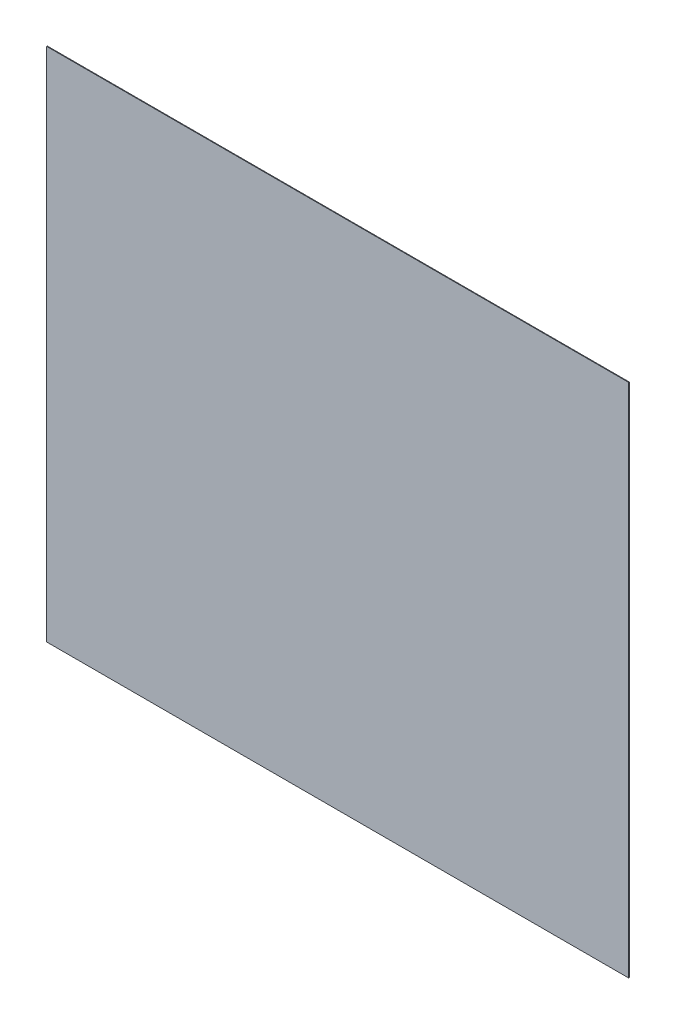
ISO-10303-21;
HEADER;
FILE_DESCRIPTION(('STEP AP214'),'2;1');
FILE_NAME('part.step','',(''),(''),'','','');
FILE_SCHEMA(('AUTOMOTIVE_DESIGN { 1 0 10303 214 1 1 1 1 }'));
ENDSEC;
DATA;
#1=APPLICATION_CONTEXT('core data for automotive mechanical design processes');
#2=APPLICATION_PROTOCOL_DEFINITION('international standard','automotive_design',2000,#1);
#3=PRODUCT_CONTEXT('',#1,'mechanical');
#4=PRODUCT('Part','Part','',(#3));
#5=PRODUCT_RELATED_PRODUCT_CATEGORY('part','',(#4));
#6=PRODUCT_DEFINITION_FORMATION('','',#4);
#7=PRODUCT_DEFINITION_CONTEXT('part definition',#1,'design');
#8=PRODUCT_DEFINITION('design','',#6,#7);
#9=PRODUCT_DEFINITION_SHAPE('','',#8);
#10=(LENGTH_UNIT() NAMED_UNIT(*) SI_UNIT(.MILLI.,.METRE.));
#11=(NAMED_UNIT(*) PLANE_ANGLE_UNIT() SI_UNIT($,.RADIAN.));
#12=(NAMED_UNIT(*) SI_UNIT($,.STERADIAN.) SOLID_ANGLE_UNIT());
#13=UNCERTAINTY_MEASURE_WITH_UNIT(LENGTH_MEASURE(1.E-05),#10,'distance_accuracy_value','');
#14=(GEOMETRIC_REPRESENTATION_CONTEXT(3) GLOBAL_UNCERTAINTY_ASSIGNED_CONTEXT((#13)) GLOBAL_UNIT_ASSIGNED_CONTEXT((#10,
#11,#12)) REPRESENTATION_CONTEXT('',''));
#15=CARTESIAN_POINT('',(0.,0.,0.));
#16=DIRECTION('',(0.,0.,1.));
#17=DIRECTION('',(1.,0.,0.));
#18=AXIS2_PLACEMENT_3D('',#15,#16,#17);
#19=CARTESIAN_POINT('',(706.,-625.75,-1.5875));
#20=DIRECTION('',(1.,0.,0.));
#21=DIRECTION('',(0.,0.,-1.));
#22=AXIS2_PLACEMENT_3D('',#19,#20,#21);
#23=PLANE('',#22);
#24=DIRECTION('',(0.,1.,0.));
#25=VECTOR('',#24,1.);
#26=CARTESIAN_POINT('',(706.,-625.75,0.));
#27=LINE('',#26,#25);
#28=CARTESIAN_POINT('',(706.,-625.75,0.));
#29=VERTEX_POINT('',#28);
#30=CARTESIAN_POINT('',(706.,625.75,0.));
#31=VERTEX_POINT('',#30);
#32=EDGE_CURVE('E104',#29,#31,#27,.T.);
#33=ORIENTED_EDGE('',*,*,#32,.F.);
#34=DIRECTION('',(0.,0.,1.));
#35=VECTOR('',#34,1.);
#36=CARTESIAN_POINT('',(706.,-625.75,-1.5875));
#37=LINE('',#36,#35);
#38=CARTESIAN_POINT('',(706.,-625.75,-1.5875));
#39=VERTEX_POINT('',#38);
#40=EDGE_CURVE('E11',#39,#29,#37,.T.);
#41=ORIENTED_EDGE('',*,*,#40,.F.);
#42=DIRECTION('',(0.,1.,0.));
#43=VECTOR('',#42,1.);
#44=CARTESIAN_POINT('',(706.,-625.75,-1.5875));
#45=LINE('',#44,#43);
#46=CARTESIAN_POINT('',(706.,625.75,-1.5875));
#47=VERTEX_POINT('',#46);
#48=EDGE_CURVE('E98',#39,#47,#45,.T.);
#49=ORIENTED_EDGE('',*,*,#48,.T.);
#50=DIRECTION('',(0.,0.,1.));
#51=VECTOR('',#50,1.);
#52=CARTESIAN_POINT('',(706.,625.75,-1.5875));
#53=LINE('',#52,#51);
#54=EDGE_CURVE('E43',#47,#31,#53,.T.);
#55=ORIENTED_EDGE('',*,*,#54,.T.);
#56=EDGE_LOOP('',(#33,#41,#49,#55));
#57=FACE_BOUND('',#56,.T.);
#58=ADVANCED_FACE('F40',(#57),#23,.T.);
#59=CARTESIAN_POINT('',(-706.,-625.75,-1.5875));
#60=DIRECTION('',(0.,-1.,0.));
#61=DIRECTION('',(0.,0.,-1.));
#62=AXIS2_PLACEMENT_3D('',#59,#60,#61);
#63=PLANE('',#62);
#64=DIRECTION('',(1.,0.,0.));
#65=VECTOR('',#64,1.);
#66=CARTESIAN_POINT('',(-706.,-625.75,0.));
#67=LINE('',#66,#65);
#68=CARTESIAN_POINT('',(-706.,-625.75,0.));
#69=VERTEX_POINT('',#68);
#70=EDGE_CURVE('E100',#69,#29,#67,.T.);
#71=ORIENTED_EDGE('',*,*,#70,.F.);
#72=DIRECTION('',(0.,0.,1.));
#73=VECTOR('',#72,1.);
#74=CARTESIAN_POINT('',(-706.,-625.75,-1.5875));
#75=LINE('',#74,#73);
#76=CARTESIAN_POINT('',(-706.,-625.75,-1.5875));
#77=VERTEX_POINT('',#76);
#78=EDGE_CURVE('E49',#77,#69,#75,.T.);
#79=ORIENTED_EDGE('',*,*,#78,.F.);
#80=DIRECTION('',(1.,0.,0.));
#81=VECTOR('',#80,1.);
#82=CARTESIAN_POINT('',(-706.,-625.75,-1.5875));
#83=LINE('',#82,#81);
#84=EDGE_CURVE('E95',#77,#39,#83,.T.);
#85=ORIENTED_EDGE('',*,*,#84,.T.);
#86=ORIENTED_EDGE('',*,*,#40,.T.);
#87=EDGE_LOOP('',(#71,#79,#85,#86));
#88=FACE_BOUND('',#87,.T.);
#89=ADVANCED_FACE('F114',(#88),#63,.T.);
#90=CARTESIAN_POINT('',(-706.,-625.75,-1.5875));
#91=DIRECTION('',(-1.,0.,0.));
#92=DIRECTION('',(0.,0.,1.));
#93=AXIS2_PLACEMENT_3D('',#90,#91,#92);
#94=PLANE('',#93);
#95=DIRECTION('',(0.,-1.,0.));
#96=VECTOR('',#95,1.);
#97=CARTESIAN_POINT('',(-706.,-625.75,0.));
#98=LINE('',#97,#96);
#99=CARTESIAN_POINT('',(-706.,625.75,0.));
#100=VERTEX_POINT('',#99);
#101=EDGE_CURVE('E90',#100,#69,#98,.T.);
#102=ORIENTED_EDGE('',*,*,#101,.F.);
#103=DIRECTION('',(0.,0.,1.));
#104=VECTOR('',#103,1.);
#105=CARTESIAN_POINT('',(-706.,625.75,-1.5875));
#106=LINE('',#105,#104);
#107=CARTESIAN_POINT('',(-706.,625.75,-1.5875));
#108=VERTEX_POINT('',#107);
#109=EDGE_CURVE('E85',#108,#100,#106,.T.);
#110=ORIENTED_EDGE('',*,*,#109,.F.);
#111=DIRECTION('',(0.,-1.,0.));
#112=VECTOR('',#111,1.);
#113=CARTESIAN_POINT('',(-706.,-625.75,-1.5875));
#114=LINE('',#113,#112);
#115=EDGE_CURVE('E88',#108,#77,#114,.T.);
#116=ORIENTED_EDGE('',*,*,#115,.T.);
#117=ORIENTED_EDGE('',*,*,#78,.T.);
#118=EDGE_LOOP('',(#102,#110,#116,#117));
#119=FACE_BOUND('',#118,.T.);
#120=ADVANCED_FACE('F87',(#119),#94,.T.);
#121=CARTESIAN_POINT('',(-706.,625.75,-1.5875));
#122=DIRECTION('',(0.,1.,0.));
#123=DIRECTION('',(0.,0.,1.));
#124=AXIS2_PLACEMENT_3D('',#121,#122,#123);
#125=PLANE('',#124);
#126=DIRECTION('',(-1.,0.,0.));
#127=VECTOR('',#126,1.);
#128=CARTESIAN_POINT('',(-706.,625.75,0.));
#129=LINE('',#128,#127);
#130=EDGE_CURVE('E107',#31,#100,#129,.T.);
#131=ORIENTED_EDGE('',*,*,#130,.F.);
#132=ORIENTED_EDGE('',*,*,#54,.F.);
#133=DIRECTION('',(-1.,0.,0.));
#134=VECTOR('',#133,1.);
#135=CARTESIAN_POINT('',(-706.,625.75,-1.5875));
#136=LINE('',#135,#134);
#137=EDGE_CURVE('E94',#47,#108,#136,.T.);
#138=ORIENTED_EDGE('',*,*,#137,.T.);
#139=ORIENTED_EDGE('',*,*,#109,.T.);
#140=EDGE_LOOP('',(#131,#132,#138,#139));
#141=FACE_BOUND('',#140,.T.);
#142=ADVANCED_FACE('F97',(#141),#125,.T.);
#143=CARTESIAN_POINT('',(0.,0.,-1.5875));
#144=DIRECTION('',(0.,0.,-1.));
#145=DIRECTION('',(-1.,0.,0.));
#146=AXIS2_PLACEMENT_3D('',#143,#144,#145);
#147=PLANE('',#146);
#148=ORIENTED_EDGE('',*,*,#48,.F.);
#149=ORIENTED_EDGE('',*,*,#84,.F.);
#150=ORIENTED_EDGE('',*,*,#115,.F.);
#151=ORIENTED_EDGE('',*,*,#137,.F.);
#152=EDGE_LOOP('',(#148,#149,#150,#151));
#153=FACE_BOUND('',#152,.T.);
#154=ADVANCED_FACE('F93',(#153),#147,.T.);
#155=CARTESIAN_POINT('',(0.,0.,0.));
#156=DIRECTION('',(0.,0.,-1.));
#157=DIRECTION('',(-1.,0.,0.));
#158=AXIS2_PLACEMENT_3D('',#155,#156,#157);
#159=PLANE('',#158);
#160=ORIENTED_EDGE('',*,*,#32,.T.);
#161=ORIENTED_EDGE('',*,*,#130,.T.);
#162=ORIENTED_EDGE('',*,*,#101,.T.);
#163=ORIENTED_EDGE('',*,*,#70,.T.);
#164=EDGE_LOOP('',(#160,#161,#162,#163));
#165=FACE_BOUND('',#164,.T.);
#166=ADVANCED_FACE('F113',(#165),#159,.F.);
#167=CLOSED_SHELL('',(#58,#89,#120,#142,#154,#166));
#168=MANIFOLD_SOLID_BREP('B2',#167);
#169=ADVANCED_BREP_SHAPE_REPRESENTATION('',(#18,#168),#14);
#170=SHAPE_DEFINITION_REPRESENTATION(#9,#169);
ENDSEC;
END-ISO-10303-21;
